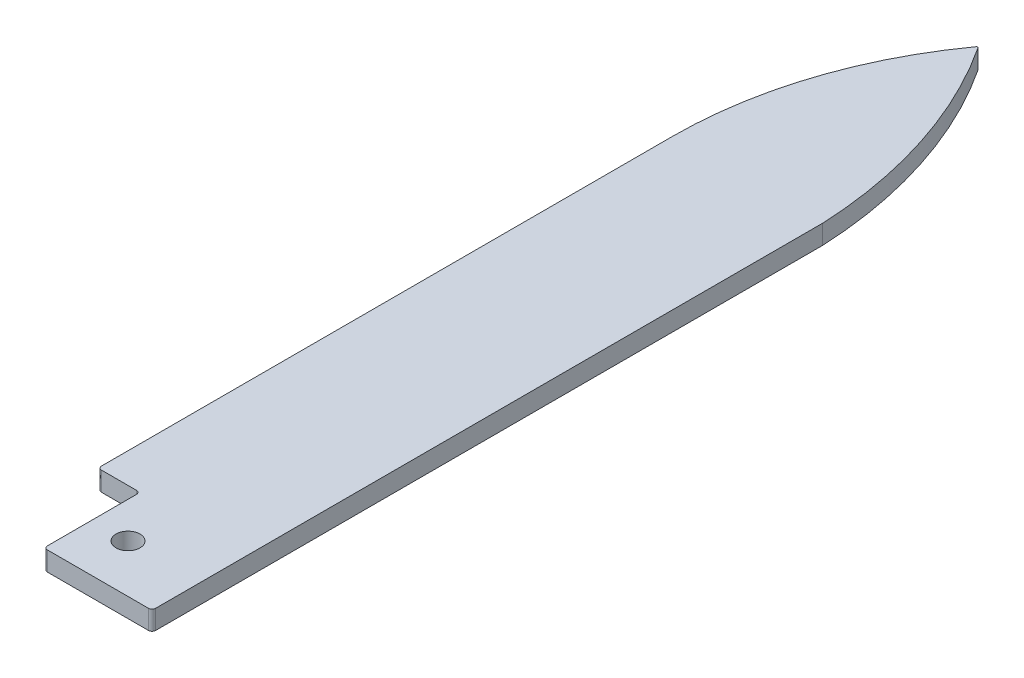
ISO-10303-21;
HEADER;
FILE_DESCRIPTION(('STEP AP214'),'2;1');
FILE_NAME('part.step','',(''),(''),'','','');
FILE_SCHEMA(('AUTOMOTIVE_DESIGN { 1 0 10303 214 1 1 1 1 }'));
ENDSEC;
DATA;
#1=APPLICATION_CONTEXT('core data for automotive mechanical design processes');
#2=APPLICATION_PROTOCOL_DEFINITION('international standard','automotive_design',2000,#1);
#3=PRODUCT_CONTEXT('',#1,'mechanical');
#4=PRODUCT('Part','Part','',(#3));
#5=PRODUCT_RELATED_PRODUCT_CATEGORY('part','',(#4));
#6=PRODUCT_DEFINITION_FORMATION('','',#4);
#7=PRODUCT_DEFINITION_CONTEXT('part definition',#1,'design');
#8=PRODUCT_DEFINITION('design','',#6,#7);
#9=PRODUCT_DEFINITION_SHAPE('','',#8);
#10=(LENGTH_UNIT() NAMED_UNIT(*) SI_UNIT(.MILLI.,.METRE.));
#11=(NAMED_UNIT(*) PLANE_ANGLE_UNIT() SI_UNIT($,.RADIAN.));
#12=(NAMED_UNIT(*) SI_UNIT($,.STERADIAN.) SOLID_ANGLE_UNIT());
#13=UNCERTAINTY_MEASURE_WITH_UNIT(LENGTH_MEASURE(1.E-05),#10,'distance_accuracy_value','');
#14=(GEOMETRIC_REPRESENTATION_CONTEXT(3) GLOBAL_UNCERTAINTY_ASSIGNED_CONTEXT((#13)) GLOBAL_UNIT_ASSIGNED_CONTEXT((#10,
#11,#12)) REPRESENTATION_CONTEXT('',''));
#15=CARTESIAN_POINT('',(0.,0.,0.));
#16=DIRECTION('',(0.,0.,1.));
#17=DIRECTION('',(1.,0.,0.));
#18=AXIS2_PLACEMENT_3D('',#15,#16,#17);
#19=CARTESIAN_POINT('',(0.,1.6,0.));
#20=DIRECTION('',(0.,0.,-1.));
#21=DIRECTION('',(-1.,0.,0.));
#22=AXIS2_PLACEMENT_3D('',#19,#20,#21);
#23=PLANE('',#22);
#24=DIRECTION('',(1.,0.,0.));
#25=VECTOR('',#24,1.);
#26=CARTESIAN_POINT('',(0.,1.6,0.));
#27=LINE('',#26,#25);
#28=CARTESIAN_POINT('',(3.8,1.6,0.));
#29=VERTEX_POINT('',#28);
#30=CARTESIAN_POINT('',(12.2,1.6,0.));
#31=VERTEX_POINT('',#30);
#32=EDGE_CURVE('E139',#29,#31,#27,.T.);
#33=ORIENTED_EDGE('',*,*,#32,.F.);
#34=DIRECTION('',(0.,1.,0.));
#35=VECTOR('',#34,1.);
#36=CARTESIAN_POINT('',(3.8,1.6,0.));
#37=LINE('',#36,#35);
#38=CARTESIAN_POINT('',(3.8,0.,0.));
#39=VERTEX_POINT('',#38);
#40=EDGE_CURVE('E59',#29,#39,#37,.F.);
#41=ORIENTED_EDGE('',*,*,#40,.T.);
#42=DIRECTION('',(1.,0.,0.));
#43=VECTOR('',#42,1.);
#44=CARTESIAN_POINT('',(0.,0.,0.));
#45=LINE('',#44,#43);
#46=CARTESIAN_POINT('',(12.2,0.,0.));
#47=VERTEX_POINT('',#46);
#48=EDGE_CURVE('E161',#39,#47,#45,.T.);
#49=ORIENTED_EDGE('',*,*,#48,.T.);
#50=DIRECTION('',(0.,-1.,0.));
#51=VECTOR('',#50,1.);
#52=CARTESIAN_POINT('',(12.2,1.6,0.));
#53=LINE('',#52,#51);
#54=EDGE_CURVE('E204',#47,#31,#53,.F.);
#55=ORIENTED_EDGE('',*,*,#54,.T.);
#56=EDGE_LOOP('',(#33,#41,#49,#55));
#57=FACE_BOUND('',#56,.T.);
#58=ADVANCED_FACE('F37',(#57),#23,.F.);
#59=CARTESIAN_POINT('',(12.5,1.6,-55.7785275801104));
#60=DIRECTION('',(-1.,0.,0.));
#61=DIRECTION('',(0.,0.,1.));
#62=AXIS2_PLACEMENT_3D('',#59,#60,#61);
#63=PLANE('',#62);
#64=DIRECTION('',(0.,0.,-1.));
#65=VECTOR('',#64,1.);
#66=CARTESIAN_POINT('',(12.5,1.6,-55.7785275801104));
#67=LINE('',#66,#65);
#68=CARTESIAN_POINT('',(12.5,1.6,-0.300000000000002));
#69=VERTEX_POINT('',#68);
#70=CARTESIAN_POINT('',(12.5,1.6,-55.7785275801104));
#71=VERTEX_POINT('',#70);
#72=EDGE_CURVE('E126',#69,#71,#67,.T.);
#73=ORIENTED_EDGE('',*,*,#72,.F.);
#74=DIRECTION('',(0.,-1.,0.));
#75=VECTOR('',#74,1.);
#76=CARTESIAN_POINT('',(12.5,1.6,-0.300000000000002));
#77=LINE('',#76,#75);
#78=CARTESIAN_POINT('',(12.5,0.,-0.300000000000002));
#79=VERTEX_POINT('',#78);
#80=EDGE_CURVE('E207',#69,#79,#77,.T.);
#81=ORIENTED_EDGE('',*,*,#80,.T.);
#82=DIRECTION('',(0.,0.,-1.));
#83=VECTOR('',#82,1.);
#84=CARTESIAN_POINT('',(12.5,0.,-55.7785275801104));
#85=LINE('',#84,#83);
#86=CARTESIAN_POINT('',(12.5,0.,-55.7785275801104));
#87=VERTEX_POINT('',#86);
#88=EDGE_CURVE('E144',#79,#87,#85,.T.);
#89=ORIENTED_EDGE('',*,*,#88,.T.);
#90=DIRECTION('',(0.,-1.,0.));
#91=VECTOR('',#90,1.);
#92=CARTESIAN_POINT('',(12.5,1.6,-55.7785275801104));
#93=LINE('',#92,#91);
#94=EDGE_CURVE('E142',#71,#87,#93,.T.);
#95=ORIENTED_EDGE('',*,*,#94,.F.);
#96=EDGE_LOOP('',(#73,#81,#89,#95));
#97=FACE_BOUND('',#96,.T.);
#98=ADVANCED_FACE('F143',(#97),#63,.F.);
#99=CARTESIAN_POINT('',(-25.288196337873,1.6,-54.1182761997637));
#100=DIRECTION('',(0.,-1.,0.));
#101=DIRECTION('',(0.,0.,-1.));
#102=AXIS2_PLACEMENT_3D('',#99,#100,#101);
#103=CYLINDRICAL_SURFACE('',#102,37.8246509186216);
#104=CARTESIAN_POINT('',(-25.288196337873,0.,-54.1182761997637));
#105=DIRECTION('',(0.,1.,0.));
#106=DIRECTION('',(0.,0.,-1.));
#107=AXIS2_PLACEMENT_3D('',#104,#105,#106);
#108=CIRCLE('',#107,37.8246509186216);
#109=CARTESIAN_POINT('',(6.32975624845234,0.,-74.8790394652235));
#110=VERTEX_POINT('',#109);
#111=EDGE_CURVE('E165',#87,#110,#108,.T.);
#112=ORIENTED_EDGE('',*,*,#111,.T.);
#113=DIRECTION('',(0.,-1.,0.));
#114=VECTOR('',#113,1.);
#115=CARTESIAN_POINT('',(6.32975624845233,1.6,-74.8790394652235));
#116=LINE('',#115,#114);
#117=CARTESIAN_POINT('',(6.32975624845234,1.6,-74.8790394652235));
#118=VERTEX_POINT('',#117);
#119=EDGE_CURVE('E153',#110,#118,#116,.F.);
#120=ORIENTED_EDGE('',*,*,#119,.T.);
#121=CARTESIAN_POINT('',(-25.288196337873,1.6,-54.1182761997637));
#122=DIRECTION('',(0.,1.,0.));
#123=DIRECTION('',(0.,0.,-1.));
#124=AXIS2_PLACEMENT_3D('',#121,#122,#123);
#125=CIRCLE('',#124,37.8246509186216);
#126=EDGE_CURVE('E131',#71,#118,#125,.T.);
#127=ORIENTED_EDGE('',*,*,#126,.F.);
#128=ORIENTED_EDGE('',*,*,#94,.T.);
#129=EDGE_LOOP('',(#112,#120,#127,#128));
#130=FACE_BOUND('',#129,.T.);
#131=ADVANCED_FACE('F151',(#130),#103,.T.);
#132=CARTESIAN_POINT('',(32.6822001590861,1.6,-55.7785275801104));
#133=DIRECTION('',(0.,-1.,0.));
#134=DIRECTION('',(0.,0.,-1.));
#135=AXIS2_PLACEMENT_3D('',#132,#133,#134);
#136=CYLINDRICAL_SURFACE('',#135,32.6822001590861);
#137=CARTESIAN_POINT('',(32.6822001590861,1.6,-55.7785275801104));
#138=DIRECTION('',(0.,1.,0.));
#139=DIRECTION('',(0.,0.,-1.));
#140=AXIS2_PLACEMENT_3D('',#137,#138,#139);
#141=CIRCLE('',#140,32.6822001590861);
#142=CARTESIAN_POINT('',(6.16502895194209,1.6,-74.8826066840499));
#143=VERTEX_POINT('',#142);
#144=CARTESIAN_POINT('',(0.,1.6,-55.7785275801104));
#145=VERTEX_POINT('',#144);
#146=EDGE_CURVE('E154',#143,#145,#141,.T.);
#147=ORIENTED_EDGE('',*,*,#146,.F.);
#148=DIRECTION('',(0.,-1.,0.));
#149=VECTOR('',#148,1.);
#150=CARTESIAN_POINT('',(6.16502895194209,1.6,-74.8826066840499));
#151=LINE('',#150,#149);
#152=CARTESIAN_POINT('',(6.16502895194209,0.,-74.8826066840499));
#153=VERTEX_POINT('',#152);
#154=EDGE_CURVE('E148',#143,#153,#151,.T.);
#155=ORIENTED_EDGE('',*,*,#154,.T.);
#156=CARTESIAN_POINT('',(32.6822001590861,0.,-55.7785275801104));
#157=DIRECTION('',(0.,1.,0.));
#158=DIRECTION('',(0.,0.,-1.));
#159=AXIS2_PLACEMENT_3D('',#156,#157,#158);
#160=CIRCLE('',#159,32.6822001590861);
#161=CARTESIAN_POINT('',(0.,0.,-55.7785275801104));
#162=VERTEX_POINT('',#161);
#163=EDGE_CURVE('E167',#153,#162,#160,.T.);
#164=ORIENTED_EDGE('',*,*,#163,.T.);
#165=DIRECTION('',(0.,-1.,0.));
#166=VECTOR('',#165,1.);
#167=CARTESIAN_POINT('',(0.,1.6,-55.7785275801104));
#168=LINE('',#167,#166);
#169=EDGE_CURVE('E149',#145,#162,#168,.T.);
#170=ORIENTED_EDGE('',*,*,#169,.F.);
#171=EDGE_LOOP('',(#147,#155,#164,#170));
#172=FACE_BOUND('',#171,.T.);
#173=ADVANCED_FACE('F252',(#172),#136,.T.);
#174=CARTESIAN_POINT('',(0.,1.6,0.));
#175=DIRECTION('',(1.,0.,0.));
#176=DIRECTION('',(0.,0.,-1.));
#177=AXIS2_PLACEMENT_3D('',#174,#175,#176);
#178=PLANE('',#177);
#179=DIRECTION('',(0.,0.,1.));
#180=VECTOR('',#179,1.);
#181=CARTESIAN_POINT('',(0.,0.,0.));
#182=LINE('',#181,#180);
#183=CARTESIAN_POINT('',(0.,0.,-8.3));
#184=VERTEX_POINT('',#183);
#185=EDGE_CURVE('E169',#162,#184,#182,.T.);
#186=ORIENTED_EDGE('',*,*,#185,.T.);
#187=DIRECTION('',(0.,1.,0.));
#188=VECTOR('',#187,1.);
#189=CARTESIAN_POINT('',(0.,1.6,-8.3));
#190=LINE('',#189,#188);
#191=CARTESIAN_POINT('',(0.,1.6,-8.3));
#192=VERTEX_POINT('',#191);
#193=EDGE_CURVE('E191',#184,#192,#190,.T.);
#194=ORIENTED_EDGE('',*,*,#193,.T.);
#195=DIRECTION('',(0.,0.,1.));
#196=VECTOR('',#195,1.);
#197=CARTESIAN_POINT('',(0.,1.6,0.));
#198=LINE('',#197,#196);
#199=EDGE_CURVE('E156',#145,#192,#198,.T.);
#200=ORIENTED_EDGE('',*,*,#199,.F.);
#201=ORIENTED_EDGE('',*,*,#169,.T.);
#202=EDGE_LOOP('',(#186,#194,#200,#201));
#203=FACE_BOUND('',#202,.T.);
#204=ADVANCED_FACE('F256',(#203),#178,.F.);
#205=CARTESIAN_POINT('',(-25.288196337873,1.6,-54.1182761997637));
#206=DIRECTION('',(0.,-1.,0.));
#207=DIRECTION('',(0.,0.,-1.));
#208=AXIS2_PLACEMENT_3D('',#205,#206,#207);
#209=PLANE('',#208);
#210=CARTESIAN_POINT('',(6.5,1.6,-4.));
#211=DIRECTION('',(0.,1.,0.));
#212=DIRECTION('',(0.,0.,1.));
#213=AXIS2_PLACEMENT_3D('',#210,#211,#212);
#214=CIRCLE('',#213,1.);
#215=CARTESIAN_POINT('',(6.5,1.6,-3.));
#216=VERTEX_POINT('',#215);
#217=EDGE_CURVE('E222',#216,#216,#214,.T.);
#218=ORIENTED_EDGE('',*,*,#217,.F.);
#219=EDGE_LOOP('',(#218));
#220=FACE_BOUND('',#219,.T.);
#221=ORIENTED_EDGE('',*,*,#199,.T.);
#222=CARTESIAN_POINT('',(0.3,1.6,-8.3));
#223=DIRECTION('',(0.,-1.,0.));
#224=DIRECTION('',(0.,0.,-1.));
#225=AXIS2_PLACEMENT_3D('',#222,#223,#224);
#226=CIRCLE('',#225,0.3);
#227=CARTESIAN_POINT('',(0.3,1.6,-8.));
#228=VERTEX_POINT('',#227);
#229=EDGE_CURVE('E197',#192,#228,#226,.F.);
#230=ORIENTED_EDGE('',*,*,#229,.T.);
#231=DIRECTION('',(-1.,0.,0.));
#232=VECTOR('',#231,1.);
#233=CARTESIAN_POINT('',(0.,1.6,-8.));
#234=LINE('',#233,#232);
#235=CARTESIAN_POINT('',(3.2,1.6,-8.));
#236=VERTEX_POINT('',#235);
#237=EDGE_CURVE('E213',#236,#228,#234,.T.);
#238=ORIENTED_EDGE('',*,*,#237,.F.);
#239=CARTESIAN_POINT('',(3.2,1.6,-7.7));
#240=DIRECTION('',(0.,-1.,0.));
#241=DIRECTION('',(0.,0.,-1.));
#242=AXIS2_PLACEMENT_3D('',#239,#240,#241);
#243=CIRCLE('',#242,0.3);
#244=CARTESIAN_POINT('',(3.5,1.6,-7.7));
#245=VERTEX_POINT('',#244);
#246=EDGE_CURVE('E45',#236,#245,#243,.T.);
#247=ORIENTED_EDGE('',*,*,#246,.T.);
#248=DIRECTION('',(0.,0.,-1.));
#249=VECTOR('',#248,1.);
#250=CARTESIAN_POINT('',(3.5,1.6,0.));
#251=LINE('',#250,#249);
#252=CARTESIAN_POINT('',(3.5,1.6,-0.3));
#253=VERTEX_POINT('',#252);
#254=EDGE_CURVE('E211',#253,#245,#251,.T.);
#255=ORIENTED_EDGE('',*,*,#254,.F.);
#256=CARTESIAN_POINT('',(3.8,1.6,-0.3));
#257=DIRECTION('',(0.,-1.,0.));
#258=DIRECTION('',(0.,0.,-1.));
#259=AXIS2_PLACEMENT_3D('',#256,#257,#258);
#260=CIRCLE('',#259,0.3);
#261=EDGE_CURVE('E195',#253,#29,#260,.F.);
#262=ORIENTED_EDGE('',*,*,#261,.T.);
#263=ORIENTED_EDGE('',*,*,#32,.T.);
#264=CARTESIAN_POINT('',(12.2,1.6,-0.300000000000002));
#265=DIRECTION('',(0.,-1.,0.));
#266=DIRECTION('',(0.,0.,-1.));
#267=AXIS2_PLACEMENT_3D('',#264,#265,#266);
#268=CIRCLE('',#267,0.3);
#269=EDGE_CURVE('E135',#31,#69,#268,.F.);
#270=ORIENTED_EDGE('',*,*,#269,.T.);
#271=ORIENTED_EDGE('',*,*,#72,.T.);
#272=ORIENTED_EDGE('',*,*,#126,.T.);
#273=CARTESIAN_POINT('',(6.24616538424489,1.6,-74.8241526050377));
#274=DIRECTION('',(0.,-1.,0.));
#275=DIRECTION('',(0.,0.,-1.));
#276=AXIS2_PLACEMENT_3D('',#273,#274,#275);
#277=CIRCLE('',#276,0.1);
#278=EDGE_CURVE('E179',#118,#143,#277,.F.);
#279=ORIENTED_EDGE('',*,*,#278,.T.);
#280=ORIENTED_EDGE('',*,*,#146,.T.);
#281=EDGE_LOOP('',(#221,#230,#238,#247,#255,#262,#263,#270,#271,#272,#279,#280));
#282=FACE_BOUND('',#281,.T.);
#283=ADVANCED_FACE('F129',(#220,#282),#209,.F.);
#284=CARTESIAN_POINT('',(-25.288196337873,0.,-54.1182761997637));
#285=DIRECTION('',(0.,-1.,0.));
#286=DIRECTION('',(0.,0.,-1.));
#287=AXIS2_PLACEMENT_3D('',#284,#285,#286);
#288=PLANE('',#287);
#289=DIRECTION('',(-1.,0.,0.));
#290=VECTOR('',#289,1.);
#291=CARTESIAN_POINT('',(0.,0.,-8.));
#292=LINE('',#291,#290);
#293=CARTESIAN_POINT('',(3.2,0.,-8.));
#294=VERTEX_POINT('',#293);
#295=CARTESIAN_POINT('',(0.3,0.,-8.));
#296=VERTEX_POINT('',#295);
#297=EDGE_CURVE('E163',#294,#296,#292,.T.);
#298=ORIENTED_EDGE('',*,*,#297,.T.);
#299=CARTESIAN_POINT('',(0.3,0.,-8.3));
#300=DIRECTION('',(0.,-1.,0.));
#301=DIRECTION('',(0.,0.,-1.));
#302=AXIS2_PLACEMENT_3D('',#299,#300,#301);
#303=CIRCLE('',#302,0.3);
#304=EDGE_CURVE('E202',#296,#184,#303,.T.);
#305=ORIENTED_EDGE('',*,*,#304,.T.);
#306=ORIENTED_EDGE('',*,*,#185,.F.);
#307=ORIENTED_EDGE('',*,*,#163,.F.);
#308=CARTESIAN_POINT('',(6.24616538424489,0.,-74.8241526050377));
#309=DIRECTION('',(0.,-1.,0.));
#310=DIRECTION('',(0.,0.,-1.));
#311=AXIS2_PLACEMENT_3D('',#308,#309,#310);
#312=CIRCLE('',#311,0.1);
#313=EDGE_CURVE('E176',#153,#110,#312,.T.);
#314=ORIENTED_EDGE('',*,*,#313,.T.);
#315=ORIENTED_EDGE('',*,*,#111,.F.);
#316=ORIENTED_EDGE('',*,*,#88,.F.);
#317=CARTESIAN_POINT('',(12.2,0.,-0.300000000000002));
#318=DIRECTION('',(0.,-1.,0.));
#319=DIRECTION('',(0.,0.,-1.));
#320=AXIS2_PLACEMENT_3D('',#317,#318,#319);
#321=CIRCLE('',#320,0.3);
#322=EDGE_CURVE('E52',#79,#47,#321,.T.);
#323=ORIENTED_EDGE('',*,*,#322,.T.);
#324=ORIENTED_EDGE('',*,*,#48,.F.);
#325=CARTESIAN_POINT('',(3.8,0.,-0.3));
#326=DIRECTION('',(0.,-1.,0.));
#327=DIRECTION('',(0.,0.,-1.));
#328=AXIS2_PLACEMENT_3D('',#325,#326,#327);
#329=CIRCLE('',#328,0.3);
#330=CARTESIAN_POINT('',(3.5,0.,-0.3));
#331=VERTEX_POINT('',#330);
#332=EDGE_CURVE('E200',#39,#331,#329,.T.);
#333=ORIENTED_EDGE('',*,*,#332,.T.);
#334=DIRECTION('',(0.,0.,-1.));
#335=VECTOR('',#334,1.);
#336=CARTESIAN_POINT('',(3.5,0.,0.));
#337=LINE('',#336,#335);
#338=CARTESIAN_POINT('',(3.5,0.,-7.7));
#339=VERTEX_POINT('',#338);
#340=EDGE_CURVE('E231',#331,#339,#337,.T.);
#341=ORIENTED_EDGE('',*,*,#340,.T.);
#342=CARTESIAN_POINT('',(3.2,0.,-7.7));
#343=DIRECTION('',(0.,-1.,0.));
#344=DIRECTION('',(0.,0.,-1.));
#345=AXIS2_PLACEMENT_3D('',#342,#343,#344);
#346=CIRCLE('',#345,0.3);
#347=EDGE_CURVE('E11',#339,#294,#346,.F.);
#348=ORIENTED_EDGE('',*,*,#347,.T.);
#349=EDGE_LOOP('',(#298,#305,#306,#307,#314,#315,#316,#323,#324,#333,#341,#348));
#350=FACE_BOUND('',#349,.T.);
#351=CARTESIAN_POINT('',(6.5,0.,-4.));
#352=DIRECTION('',(0.,1.,0.));
#353=DIRECTION('',(0.,0.,1.));
#354=AXIS2_PLACEMENT_3D('',#351,#352,#353);
#355=CIRCLE('',#354,1.);
#356=CARTESIAN_POINT('',(6.5,0.,-3.));
#357=VERTEX_POINT('',#356);
#358=EDGE_CURVE('E241',#357,#357,#355,.T.);
#359=ORIENTED_EDGE('',*,*,#358,.T.);
#360=EDGE_LOOP('',(#359));
#361=FACE_BOUND('',#360,.T.);
#362=ADVANCED_FACE('F228',(#350,#361),#288,.T.);
#363=CARTESIAN_POINT('',(6.24616538424489,1.6,-74.8241526050377));
#364=DIRECTION('',(0.,-1.,0.));
#365=DIRECTION('',(0.,0.,-1.));
#366=AXIS2_PLACEMENT_3D('',#363,#364,#365);
#367=CYLINDRICAL_SURFACE('',#366,0.1);
#368=ORIENTED_EDGE('',*,*,#278,.F.);
#369=ORIENTED_EDGE('',*,*,#119,.F.);
#370=ORIENTED_EDGE('',*,*,#313,.F.);
#371=ORIENTED_EDGE('',*,*,#154,.F.);
#372=EDGE_LOOP('',(#368,#369,#370,#371));
#373=FACE_BOUND('',#372,.T.);
#374=ADVANCED_FACE('F247',(#373),#367,.T.);
#375=CARTESIAN_POINT('',(6.5,0.,-4.));
#376=DIRECTION('',(0.,1.,0.));
#377=DIRECTION('',(0.,0.,1.));
#378=AXIS2_PLACEMENT_3D('',#375,#376,#377);
#379=CYLINDRICAL_SURFACE('',#378,1.);
#380=ORIENTED_EDGE('',*,*,#358,.F.);
#381=EDGE_LOOP('',(#380));
#382=FACE_BOUND('',#381,.T.);
#383=ORIENTED_EDGE('',*,*,#217,.T.);
#384=EDGE_LOOP('',(#383));
#385=FACE_BOUND('',#384,.T.);
#386=ADVANCED_FACE('F278',(#382,#385),#379,.F.);
#387=CARTESIAN_POINT('',(0.,0.,-8.));
#388=DIRECTION('',(0.,0.,-1.));
#389=DIRECTION('',(-1.,0.,0.));
#390=AXIS2_PLACEMENT_3D('',#387,#388,#389);
#391=PLANE('',#390);
#392=ORIENTED_EDGE('',*,*,#297,.F.);
#393=DIRECTION('',(0.,1.,0.));
#394=VECTOR('',#393,1.);
#395=CARTESIAN_POINT('',(3.2,1.6,-8.));
#396=LINE('',#395,#394);
#397=EDGE_CURVE('E183',#294,#236,#396,.T.);
#398=ORIENTED_EDGE('',*,*,#397,.T.);
#399=ORIENTED_EDGE('',*,*,#237,.T.);
#400=DIRECTION('',(0.,1.,0.));
#401=VECTOR('',#400,1.);
#402=CARTESIAN_POINT('',(0.3,0.,-8.));
#403=LINE('',#402,#401);
#404=EDGE_CURVE('E181',#228,#296,#403,.F.);
#405=ORIENTED_EDGE('',*,*,#404,.T.);
#406=EDGE_LOOP('',(#392,#398,#399,#405));
#407=FACE_BOUND('',#406,.T.);
#408=ADVANCED_FACE('F233',(#407),#391,.F.);
#409=CARTESIAN_POINT('',(3.5,0.,0.));
#410=DIRECTION('',(1.,0.,0.));
#411=DIRECTION('',(0.,0.,-1.));
#412=AXIS2_PLACEMENT_3D('',#409,#410,#411);
#413=PLANE('',#412);
#414=ORIENTED_EDGE('',*,*,#254,.T.);
#415=DIRECTION('',(0.,1.,0.));
#416=VECTOR('',#415,1.);
#417=CARTESIAN_POINT('',(3.5,0.,-7.7));
#418=LINE('',#417,#416);
#419=EDGE_CURVE('E189',#245,#339,#418,.F.);
#420=ORIENTED_EDGE('',*,*,#419,.T.);
#421=ORIENTED_EDGE('',*,*,#340,.F.);
#422=DIRECTION('',(0.,1.,0.));
#423=VECTOR('',#422,1.);
#424=CARTESIAN_POINT('',(3.5,0.,-0.3));
#425=LINE('',#424,#423);
#426=EDGE_CURVE('E186',#331,#253,#425,.T.);
#427=ORIENTED_EDGE('',*,*,#426,.T.);
#428=EDGE_LOOP('',(#414,#420,#421,#427));
#429=FACE_BOUND('',#428,.T.);
#430=ADVANCED_FACE('F218',(#429),#413,.F.);
#431=CARTESIAN_POINT('',(3.2,0.,-7.7));
#432=DIRECTION('',(0.,-1.,0.));
#433=DIRECTION('',(0.,0.,-1.));
#434=AXIS2_PLACEMENT_3D('',#431,#432,#433);
#435=CYLINDRICAL_SURFACE('',#434,0.3);
#436=ORIENTED_EDGE('',*,*,#347,.F.);
#437=ORIENTED_EDGE('',*,*,#419,.F.);
#438=ORIENTED_EDGE('',*,*,#246,.F.);
#439=ORIENTED_EDGE('',*,*,#397,.F.);
#440=EDGE_LOOP('',(#436,#437,#438,#439));
#441=FACE_BOUND('',#440,.T.);
#442=ADVANCED_FACE('F225',(#441),#435,.F.);
#443=CARTESIAN_POINT('',(0.3,1.6,-8.3));
#444=DIRECTION('',(0.,1.,0.));
#445=DIRECTION('',(0.,0.,1.));
#446=AXIS2_PLACEMENT_3D('',#443,#444,#445);
#447=CYLINDRICAL_SURFACE('',#446,0.3);
#448=ORIENTED_EDGE('',*,*,#304,.F.);
#449=ORIENTED_EDGE('',*,*,#404,.F.);
#450=ORIENTED_EDGE('',*,*,#229,.F.);
#451=ORIENTED_EDGE('',*,*,#193,.F.);
#452=EDGE_LOOP('',(#448,#449,#450,#451));
#453=FACE_BOUND('',#452,.T.);
#454=ADVANCED_FACE('F259',(#453),#447,.T.);
#455=CARTESIAN_POINT('',(3.8,0.,-0.3));
#456=DIRECTION('',(0.,1.,0.));
#457=DIRECTION('',(0.,0.,1.));
#458=AXIS2_PLACEMENT_3D('',#455,#456,#457);
#459=CYLINDRICAL_SURFACE('',#458,0.3);
#460=ORIENTED_EDGE('',*,*,#332,.F.);
#461=ORIENTED_EDGE('',*,*,#40,.F.);
#462=ORIENTED_EDGE('',*,*,#261,.F.);
#463=ORIENTED_EDGE('',*,*,#426,.F.);
#464=EDGE_LOOP('',(#460,#461,#462,#463));
#465=FACE_BOUND('',#464,.T.);
#466=ADVANCED_FACE('F261',(#465),#459,.T.);
#467=CARTESIAN_POINT('',(12.2,1.6,-0.300000000000002));
#468=DIRECTION('',(0.,-1.,0.));
#469=DIRECTION('',(0.,0.,-1.));
#470=AXIS2_PLACEMENT_3D('',#467,#468,#469);
#471=CYLINDRICAL_SURFACE('',#470,0.3);
#472=ORIENTED_EDGE('',*,*,#269,.F.);
#473=ORIENTED_EDGE('',*,*,#54,.F.);
#474=ORIENTED_EDGE('',*,*,#322,.F.);
#475=ORIENTED_EDGE('',*,*,#80,.F.);
#476=EDGE_LOOP('',(#472,#473,#474,#475));
#477=FACE_BOUND('',#476,.T.);
#478=ADVANCED_FACE('F39',(#477),#471,.T.);
#479=CLOSED_SHELL('',(#58,#98,#131,#173,#204,#283,#362,#374,#386,#408,#430,#442,#454,#466,#478));
#480=MANIFOLD_SOLID_BREP('B2',#479);
#481=ADVANCED_BREP_SHAPE_REPRESENTATION('',(#18,#480),#14);
#482=SHAPE_DEFINITION_REPRESENTATION(#9,#481);
ENDSEC;
END-ISO-10303-21;
